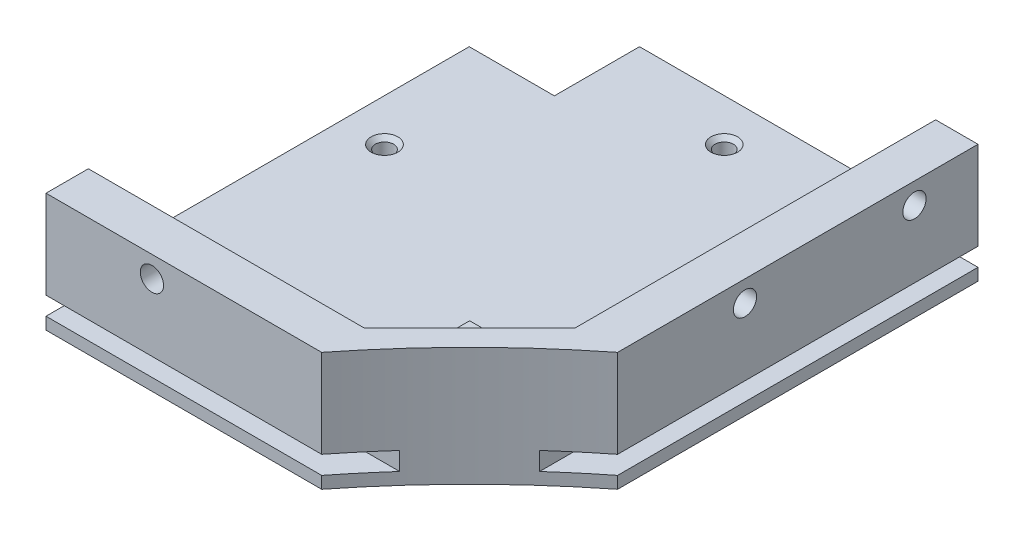
ISO-10303-21;
HEADER;
FILE_DESCRIPTION(('STEP AP214'),'2;1');
FILE_NAME('part.step','',(''),(''),'','','');
FILE_SCHEMA(('AUTOMOTIVE_DESIGN { 1 0 10303 214 1 1 1 1 }'));
ENDSEC;
DATA;
#1=APPLICATION_CONTEXT('core data for automotive mechanical design processes');
#2=APPLICATION_PROTOCOL_DEFINITION('international standard','automotive_design',2000,#1);
#3=PRODUCT_CONTEXT('',#1,'mechanical');
#4=PRODUCT('Part','Part','',(#3));
#5=PRODUCT_RELATED_PRODUCT_CATEGORY('part','',(#4));
#6=PRODUCT_DEFINITION_FORMATION('','',#4);
#7=PRODUCT_DEFINITION_CONTEXT('part definition',#1,'design');
#8=PRODUCT_DEFINITION('design','',#6,#7);
#9=PRODUCT_DEFINITION_SHAPE('','',#8);
#10=(LENGTH_UNIT() NAMED_UNIT(*) SI_UNIT(.MILLI.,.METRE.));
#11=(NAMED_UNIT(*) PLANE_ANGLE_UNIT() SI_UNIT($,.RADIAN.));
#12=(NAMED_UNIT(*) SI_UNIT($,.STERADIAN.) SOLID_ANGLE_UNIT());
#13=UNCERTAINTY_MEASURE_WITH_UNIT(LENGTH_MEASURE(1.E-05),#10,'distance_accuracy_value','');
#14=(GEOMETRIC_REPRESENTATION_CONTEXT(3) GLOBAL_UNCERTAINTY_ASSIGNED_CONTEXT((#13)) GLOBAL_UNIT_ASSIGNED_CONTEXT((#10,
#11,#12)) REPRESENTATION_CONTEXT('',''));
#15=CARTESIAN_POINT('',(0.,0.,0.));
#16=DIRECTION('',(0.,0.,1.));
#17=DIRECTION('',(1.,0.,0.));
#18=AXIS2_PLACEMENT_3D('',#15,#16,#17);
#19=CARTESIAN_POINT('',(160.08,28.,-429.92));
#20=DIRECTION('',(1.,0.,0.));
#21=DIRECTION('',(0.,0.,-1.));
#22=AXIS2_PLACEMENT_3D('',#19,#20,#21);
#23=PLANE('',#22);
#24=DIRECTION('',(0.,0.,1.));
#25=VECTOR('',#24,1.);
#26=CARTESIAN_POINT('',(160.08,17.,-489.92));
#27=LINE('',#26,#25);
#28=CARTESIAN_POINT('',(160.08,17.,-489.92));
#29=VERTEX_POINT('',#28);
#30=CARTESIAN_POINT('',(160.08,17.,-465.));
#31=VERTEX_POINT('',#30);
#32=EDGE_CURVE('E262',#29,#31,#27,.T.);
#33=ORIENTED_EDGE('',*,*,#32,.F.);
#34=DIRECTION('',(0.,-1.,0.));
#35=VECTOR('',#34,1.);
#36=CARTESIAN_POINT('',(160.08,28.,-489.92));
#37=LINE('',#36,#35);
#38=CARTESIAN_POINT('',(160.08,8.,-489.92));
#39=VERTEX_POINT('',#38);
#40=EDGE_CURVE('E272',#29,#39,#37,.T.);
#41=ORIENTED_EDGE('',*,*,#40,.T.);
#42=DIRECTION('',(0.,0.,-1.));
#43=VECTOR('',#42,1.);
#44=CARTESIAN_POINT('',(160.08,8.,-429.92));
#45=LINE('',#44,#43);
#46=CARTESIAN_POINT('',(160.08,8.,-475.));
#47=VERTEX_POINT('',#46);
#48=EDGE_CURVE('E279',#47,#39,#45,.T.);
#49=ORIENTED_EDGE('',*,*,#48,.F.);
#50=DIRECTION('',(0.,-0.668964731622449,-0.743294146247167));
#51=VECTOR('',#50,1.);
#52=CARTESIAN_POINT('',(160.08,17.,-465.));
#53=LINE('',#52,#51);
#54=EDGE_CURVE('E319',#31,#47,#53,.T.);
#55=ORIENTED_EDGE('',*,*,#54,.F.);
#56=EDGE_LOOP('',(#33,#41,#49,#55));
#57=FACE_BOUND('',#56,.T.);
#58=ADVANCED_FACE('F48',(#57),#23,.F.);
#59=CARTESIAN_POINT('',(0.,0.,-489.92));
#60=DIRECTION('',(0.,0.,1.));
#61=DIRECTION('',(1.,0.,0.));
#62=AXIS2_PLACEMENT_3D('',#59,#60,#61);
#63=PLANE('',#62);
#64=DIRECTION('',(-1.,0.,0.));
#65=VECTOR('',#64,1.);
#66=CARTESIAN_POINT('',(185.,17.,-489.92));
#67=LINE('',#66,#65);
#68=CARTESIAN_POINT('',(185.,17.,-489.92));
#69=VERTEX_POINT('',#68);
#70=EDGE_CURVE('E259',#69,#29,#67,.T.);
#71=ORIENTED_EDGE('',*,*,#70,.F.);
#72=DIRECTION('',(0.743294146247166,0.66896473162245,0.));
#73=VECTOR('',#72,1.);
#74=CARTESIAN_POINT('',(185.,17.,-489.92));
#75=LINE('',#74,#73);
#76=CARTESIAN_POINT('',(175.,8.,-489.92));
#77=VERTEX_POINT('',#76);
#78=EDGE_CURVE('E327',#77,#69,#75,.T.);
#79=ORIENTED_EDGE('',*,*,#78,.F.);
#80=DIRECTION('',(1.,0.,0.));
#81=VECTOR('',#80,1.);
#82=CARTESIAN_POINT('',(160.08,8.,-489.92));
#83=LINE('',#82,#81);
#84=EDGE_CURVE('E275',#39,#77,#83,.T.);
#85=ORIENTED_EDGE('',*,*,#84,.F.);
#86=ORIENTED_EDGE('',*,*,#40,.F.);
#87=EDGE_LOOP('',(#71,#79,#85,#86));
#88=FACE_BOUND('',#87,.T.);
#89=ADVANCED_FACE('F537',(#88),#63,.F.);
#90=CARTESIAN_POINT('',(0.,8.,0.));
#91=DIRECTION('',(0.,-1.,0.));
#92=DIRECTION('',(0.,0.,-1.));
#93=AXIS2_PLACEMENT_3D('',#90,#91,#92);
#94=PLANE('',#93);
#95=CARTESIAN_POINT('',(105.,8.,-524.9));
#96=DIRECTION('',(0.,-1.,0.));
#97=DIRECTION('',(0.,0.,-1.));
#98=AXIS2_PLACEMENT_3D('',#95,#96,#97);
#99=CIRCLE('',#98,3.14999999999999);
#100=CARTESIAN_POINT('',(105.,8.,-528.05));
#101=VERTEX_POINT('',#100);
#102=EDGE_CURVE('E58',#101,#101,#99,.T.);
#103=ORIENTED_EDGE('',*,*,#102,.T.);
#104=EDGE_LOOP('',(#103));
#105=FACE_BOUND('',#104,.T.);
#106=CARTESIAN_POINT('',(145.1,8.,-565.));
#107=DIRECTION('',(0.,-1.,0.));
#108=DIRECTION('',(0.,0.,-1.));
#109=AXIS2_PLACEMENT_3D('',#106,#107,#108);
#110=CIRCLE('',#109,3.14999999999999);
#111=CARTESIAN_POINT('',(145.1,8.,-568.15));
#112=VERTEX_POINT('',#111);
#113=EDGE_CURVE('E422',#112,#112,#110,.T.);
#114=ORIENTED_EDGE('',*,*,#113,.T.);
#115=EDGE_LOOP('',(#114));
#116=FACE_BOUND('',#115,.T.);
#117=DIRECTION('',(-1.,0.,0.));
#118=VECTOR('',#117,1.);
#119=CARTESIAN_POINT('',(0.,8.,-575.));
#120=LINE('',#119,#118);
#121=CARTESIAN_POINT('',(175.,8.,-575.));
#122=VERTEX_POINT('',#121);
#123=CARTESIAN_POINT('',(115.1,8.,-575.));
#124=VERTEX_POINT('',#123);
#125=EDGE_CURVE('E493',#122,#124,#120,.T.);
#126=ORIENTED_EDGE('',*,*,#125,.T.);
#127=DIRECTION('',(0.,0.,-1.));
#128=VECTOR('',#127,1.);
#129=CARTESIAN_POINT('',(115.1,8.,-575.));
#130=LINE('',#129,#128);
#131=CARTESIAN_POINT('',(115.1,8.,-554.9));
#132=VERTEX_POINT('',#131);
#133=EDGE_CURVE('E65',#132,#124,#130,.T.);
#134=ORIENTED_EDGE('',*,*,#133,.F.);
#135=DIRECTION('',(1.,0.,0.));
#136=VECTOR('',#135,1.);
#137=CARTESIAN_POINT('',(115.1,8.,-554.9));
#138=LINE('',#137,#136);
#139=CARTESIAN_POINT('',(95.,8.,-554.9));
#140=VERTEX_POINT('',#139);
#141=EDGE_CURVE('E203',#140,#132,#138,.T.);
#142=ORIENTED_EDGE('',*,*,#141,.F.);
#143=DIRECTION('',(0.,0.,1.));
#144=VECTOR('',#143,1.);
#145=CARTESIAN_POINT('',(95.,8.,0.));
#146=LINE('',#145,#144);
#147=CARTESIAN_POINT('',(95.,8.00000000000002,-475.));
#148=VERTEX_POINT('',#147);
#149=EDGE_CURVE('E215',#140,#148,#146,.T.);
#150=ORIENTED_EDGE('',*,*,#149,.T.);
#151=DIRECTION('',(-1.,0.,0.));
#152=VECTOR('',#151,1.);
#153=CARTESIAN_POINT('',(160.08,8.,-475.));
#154=LINE('',#153,#152);
#155=EDGE_CURVE('E324',#47,#148,#154,.T.);
#156=ORIENTED_EDGE('',*,*,#155,.F.);
#157=ORIENTED_EDGE('',*,*,#48,.T.);
#158=ORIENTED_EDGE('',*,*,#84,.T.);
#159=DIRECTION('',(0.,0.,-1.));
#160=VECTOR('',#159,1.);
#161=CARTESIAN_POINT('',(175.,8.,-489.92));
#162=LINE('',#161,#160);
#163=EDGE_CURVE('E346',#77,#122,#162,.T.);
#164=ORIENTED_EDGE('',*,*,#163,.T.);
#165=EDGE_LOOP('',(#126,#134,#142,#150,#156,#157,#158,#164));
#166=FACE_BOUND('',#165,.T.);
#167=ADVANCED_FACE('F213',(#105,#116,#166),#94,.F.);
#168=CARTESIAN_POINT('',(195.,0.,-489.924225024707));
#169=DIRECTION('',(1.,0.,0.));
#170=DIRECTION('',(0.,0.,-1.));
#171=AXIS2_PLACEMENT_3D('',#168,#169,#170);
#172=PLANE('',#171);
#173=DIRECTION('',(0.,1.,0.));
#174=VECTOR('',#173,1.);
#175=CARTESIAN_POINT('',(195.,0.,-575.));
#176=LINE('',#175,#174);
#177=CARTESIAN_POINT('',(195.,7.15,-575.));
#178=VERTEX_POINT('',#177);
#179=CARTESIAN_POINT('',(195.,28.,-575.));
#180=VERTEX_POINT('',#179);
#181=EDGE_CURVE('E464',#178,#180,#176,.T.);
#182=ORIENTED_EDGE('',*,*,#181,.T.);
#183=DIRECTION('',(0.,0.,-1.));
#184=VECTOR('',#183,1.);
#185=CARTESIAN_POINT('',(195.,28.,-489.92));
#186=LINE('',#185,#184);
#187=CARTESIAN_POINT('',(195.,28.,-489.924225024706));
#188=VERTEX_POINT('',#187);
#189=EDGE_CURVE('E347',#188,#180,#186,.T.);
#190=ORIENTED_EDGE('',*,*,#189,.F.);
#191=DIRECTION('',(0.,1.,0.));
#192=VECTOR('',#191,1.);
#193=CARTESIAN_POINT('',(195.,0.,-489.924225024707));
#194=LINE('',#193,#192);
#195=CARTESIAN_POINT('',(195.,7.15,-489.924225024707));
#196=VERTEX_POINT('',#195);
#197=EDGE_CURVE('E379',#188,#196,#194,.F.);
#198=ORIENTED_EDGE('',*,*,#197,.T.);
#199=DIRECTION('',(0.,0.,1.));
#200=VECTOR('',#199,1.);
#201=CARTESIAN_POINT('',(195.,7.15,-489.924225024707));
#202=LINE('',#201,#200);
#203=EDGE_CURVE('E398',#178,#196,#202,.T.);
#204=ORIENTED_EDGE('',*,*,#203,.F.);
#205=EDGE_LOOP('',(#182,#190,#198,#204));
#206=FACE_BOUND('',#205,.T.);
#207=CARTESIAN_POINT('',(195.,23.,-560.));
#208=DIRECTION('',(1.,0.,0.));
#209=DIRECTION('',(0.,0.,-1.));
#210=AXIS2_PLACEMENT_3D('',#207,#208,#209);
#211=CIRCLE('',#210,2.75000000000004);
#212=CARTESIAN_POINT('',(195.,23.,-562.75));
#213=VERTEX_POINT('',#212);
#214=EDGE_CURVE('E251',#213,#213,#211,.T.);
#215=ORIENTED_EDGE('',*,*,#214,.F.);
#216=EDGE_LOOP('',(#215));
#217=FACE_BOUND('',#216,.T.);
#218=CARTESIAN_POINT('',(195.,23.,-520.));
#219=DIRECTION('',(1.,0.,0.));
#220=DIRECTION('',(0.,0.,-1.));
#221=AXIS2_PLACEMENT_3D('',#218,#219,#220);
#222=CIRCLE('',#221,2.75000000000004);
#223=CARTESIAN_POINT('',(195.,23.,-522.75));
#224=VERTEX_POINT('',#223);
#225=EDGE_CURVE('E244',#224,#224,#222,.T.);
#226=ORIENTED_EDGE('',*,*,#225,.F.);
#227=EDGE_LOOP('',(#226));
#228=FACE_BOUND('',#227,.T.);
#229=ADVANCED_FACE('F551',(#206,#217,#228),#172,.T.);
#230=CARTESIAN_POINT('',(195.,0.,-455.));
#231=DIRECTION('',(0.,0.,1.));
#232=DIRECTION('',(1.,0.,0.));
#233=AXIS2_PLACEMENT_3D('',#230,#231,#232);
#234=PLANE('',#233);
#235=DIRECTION('',(0.,1.,0.));
#236=VECTOR('',#235,1.);
#237=CARTESIAN_POINT('',(95.,0.,-455.));
#238=LINE('',#237,#236);
#239=CARTESIAN_POINT('',(95.,0.,-455.));
#240=VERTEX_POINT('',#239);
#241=CARTESIAN_POINT('',(95.,2.85,-455.));
#242=VERTEX_POINT('',#241);
#243=EDGE_CURVE('E503',#240,#242,#238,.T.);
#244=ORIENTED_EDGE('',*,*,#243,.F.);
#245=DIRECTION('',(1.,0.,0.));
#246=VECTOR('',#245,1.);
#247=CARTESIAN_POINT('',(160.075774975293,0.,-455.));
#248=LINE('',#247,#246);
#249=CARTESIAN_POINT('',(160.075774975293,0.,-455.));
#250=VERTEX_POINT('',#249);
#251=EDGE_CURVE('E351',#240,#250,#248,.T.);
#252=ORIENTED_EDGE('',*,*,#251,.T.);
#253=DIRECTION('',(0.,1.,0.));
#254=VECTOR('',#253,1.);
#255=CARTESIAN_POINT('',(160.075774975293,0.,-455.));
#256=LINE('',#255,#254);
#257=CARTESIAN_POINT('',(160.075774975293,2.85,-455.));
#258=VERTEX_POINT('',#257);
#259=EDGE_CURVE('E374',#250,#258,#256,.T.);
#260=ORIENTED_EDGE('',*,*,#259,.T.);
#261=DIRECTION('',(1.,0.,0.));
#262=VECTOR('',#261,1.);
#263=CARTESIAN_POINT('',(195.,2.85,-455.));
#264=LINE('',#263,#262);
#265=EDGE_CURVE('E387',#242,#258,#264,.T.);
#266=ORIENTED_EDGE('',*,*,#265,.F.);
#267=EDGE_LOOP('',(#244,#252,#260,#266));
#268=FACE_BOUND('',#267,.T.);
#269=ADVANCED_FACE('F447',(#268),#234,.T.);
#270=CARTESIAN_POINT('',(0.,0.,0.));
#271=DIRECTION('',(0.,-1.,0.));
#272=DIRECTION('',(0.,0.,-1.));
#273=AXIS2_PLACEMENT_3D('',#270,#271,#272);
#274=PLANE('',#273);
#275=CARTESIAN_POINT('',(105.,0.,-524.9));
#276=DIRECTION('',(0.,-1.,0.));
#277=DIRECTION('',(0.,0.,-1.));
#278=AXIS2_PLACEMENT_3D('',#275,#276,#277);
#279=CIRCLE('',#278,2.15);
#280=CARTESIAN_POINT('',(105.,0.,-527.05));
#281=VERTEX_POINT('',#280);
#282=EDGE_CURVE('E218',#281,#281,#279,.T.);
#283=ORIENTED_EDGE('',*,*,#282,.F.);
#284=EDGE_LOOP('',(#283));
#285=FACE_BOUND('',#284,.T.);
#286=CARTESIAN_POINT('',(145.1,0.,-565.));
#287=DIRECTION('',(0.,-1.,0.));
#288=DIRECTION('',(0.,0.,-1.));
#289=AXIS2_PLACEMENT_3D('',#286,#287,#288);
#290=CIRCLE('',#289,2.15000000000002);
#291=CARTESIAN_POINT('',(145.1,0.,-567.15));
#292=VERTEX_POINT('',#291);
#293=EDGE_CURVE('E412',#292,#292,#290,.T.);
#294=ORIENTED_EDGE('',*,*,#293,.F.);
#295=EDGE_LOOP('',(#294));
#296=FACE_BOUND('',#295,.T.);
#297=DIRECTION('',(0.,0.,1.));
#298=VECTOR('',#297,1.);
#299=CARTESIAN_POINT('',(115.1,0.,0.));
#300=LINE('',#299,#298);
#301=CARTESIAN_POINT('',(115.1,0.,-575.));
#302=VERTEX_POINT('',#301);
#303=CARTESIAN_POINT('',(115.1,0.,-554.9));
#304=VERTEX_POINT('',#303);
#305=EDGE_CURVE('E452',#302,#304,#300,.T.);
#306=ORIENTED_EDGE('',*,*,#305,.F.);
#307=DIRECTION('',(1.,0.,0.));
#308=VECTOR('',#307,1.);
#309=CARTESIAN_POINT('',(195.,0.,-575.));
#310=LINE('',#309,#308);
#311=CARTESIAN_POINT('',(195.,0.,-575.));
#312=VERTEX_POINT('',#311);
#313=EDGE_CURVE('E455',#302,#312,#310,.T.);
#314=ORIENTED_EDGE('',*,*,#313,.T.);
#315=DIRECTION('',(0.,0.,-1.));
#316=VECTOR('',#315,1.);
#317=CARTESIAN_POINT('',(195.,0.,-455.));
#318=LINE('',#317,#316);
#319=CARTESIAN_POINT('',(195.,0.,-489.924225024707));
#320=VERTEX_POINT('',#319);
#321=EDGE_CURVE('E365',#320,#312,#318,.T.);
#322=ORIENTED_EDGE('',*,*,#321,.F.);
#323=CARTESIAN_POINT('',(325.,0.,-325.));
#324=DIRECTION('',(0.,1.,0.));
#325=DIRECTION('',(0.,0.,1.));
#326=AXIS2_PLACEMENT_3D('',#323,#324,#325);
#327=CIRCLE('',#326,210.);
#328=EDGE_CURVE('E369',#320,#250,#327,.T.);
#329=ORIENTED_EDGE('',*,*,#328,.T.);
#330=ORIENTED_EDGE('',*,*,#251,.F.);
#331=DIRECTION('',(0.,0.,-1.));
#332=VECTOR('',#331,1.);
#333=CARTESIAN_POINT('',(95.,0.,-650.));
#334=LINE('',#333,#332);
#335=CARTESIAN_POINT('',(95.,0.,-554.9));
#336=VERTEX_POINT('',#335);
#337=EDGE_CURVE('E499',#240,#336,#334,.T.);
#338=ORIENTED_EDGE('',*,*,#337,.T.);
#339=DIRECTION('',(-1.,0.,0.));
#340=VECTOR('',#339,1.);
#341=CARTESIAN_POINT('',(0.,0.,-554.9));
#342=LINE('',#341,#340);
#343=EDGE_CURVE('E205',#304,#336,#342,.T.);
#344=ORIENTED_EDGE('',*,*,#343,.F.);
#345=EDGE_LOOP('',(#306,#314,#322,#329,#330,#338,#344));
#346=FACE_BOUND('',#345,.T.);
#347=ADVANCED_FACE('F443',(#285,#296,#346),#274,.T.);
#348=CARTESIAN_POINT('',(325.,0.,-325.));
#349=DIRECTION('',(0.,1.,0.));
#350=DIRECTION('',(0.,0.,1.));
#351=AXIS2_PLACEMENT_3D('',#348,#349,#350);
#352=CYLINDRICAL_SURFACE('',#351,210.);
#353=ORIENTED_EDGE('',*,*,#197,.F.);
#354=CARTESIAN_POINT('',(325.,28.,-325.));
#355=DIRECTION('',(0.,1.,0.));
#356=DIRECTION('',(0.,0.,1.));
#357=AXIS2_PLACEMENT_3D('',#354,#355,#356);
#358=CIRCLE('',#357,210.);
#359=CARTESIAN_POINT('',(160.075774975294,28.,-455.));
#360=VERTEX_POINT('',#359);
#361=EDGE_CURVE('E266',#188,#360,#358,.T.);
#362=ORIENTED_EDGE('',*,*,#361,.T.);
#363=CARTESIAN_POINT('',(160.075774975293,7.15,-455.));
#364=VERTEX_POINT('',#363);
#365=EDGE_CURVE('E373',#364,#360,#256,.T.);
#366=ORIENTED_EDGE('',*,*,#365,.F.);
#367=CARTESIAN_POINT('',(325.,7.15000000000001,-325.));
#368=DIRECTION('',(0.,1.,0.));
#369=DIRECTION('',(0.,0.,1.));
#370=AXIS2_PLACEMENT_3D('',#367,#368,#369);
#371=CIRCLE('',#370,210.);
#372=CARTESIAN_POINT('',(168.475241575015,7.15,-465.));
#373=VERTEX_POINT('',#372);
#374=EDGE_CURVE('E304',#364,#373,#371,.F.);
#375=ORIENTED_EDGE('',*,*,#374,.T.);
#376=DIRECTION('',(0.,1.,0.));
#377=VECTOR('',#376,1.);
#378=CARTESIAN_POINT('',(168.475241575015,0.,-465.));
#379=LINE('',#378,#377);
#380=CARTESIAN_POINT('',(168.475241575015,2.85,-465.));
#381=VERTEX_POINT('',#380);
#382=EDGE_CURVE('E390',#373,#381,#379,.F.);
#383=ORIENTED_EDGE('',*,*,#382,.T.);
#384=CARTESIAN_POINT('',(325.,2.85,-325.));
#385=DIRECTION('',(0.,-1.,0.));
#386=DIRECTION('',(0.,0.,-1.));
#387=AXIS2_PLACEMENT_3D('',#384,#385,#386);
#388=CIRCLE('',#387,210.);
#389=EDGE_CURVE('E311',#381,#258,#388,.F.);
#390=ORIENTED_EDGE('',*,*,#389,.T.);
#391=ORIENTED_EDGE('',*,*,#259,.F.);
#392=ORIENTED_EDGE('',*,*,#328,.F.);
#393=CARTESIAN_POINT('',(195.,2.85,-489.924225024707));
#394=VERTEX_POINT('',#393);
#395=EDGE_CURVE('E378',#394,#320,#194,.F.);
#396=ORIENTED_EDGE('',*,*,#395,.F.);
#397=CARTESIAN_POINT('',(325.,2.84999999999998,-325.));
#398=DIRECTION('',(0.,-1.,0.));
#399=DIRECTION('',(1.,0.,0.));
#400=AXIS2_PLACEMENT_3D('',#397,#398,#399);
#401=CIRCLE('',#400,210.);
#402=CARTESIAN_POINT('',(185.,2.85,-481.524758424985));
#403=VERTEX_POINT('',#402);
#404=EDGE_CURVE('E288',#394,#403,#401,.F.);
#405=ORIENTED_EDGE('',*,*,#404,.T.);
#406=DIRECTION('',(0.,1.,0.));
#407=VECTOR('',#406,1.);
#408=CARTESIAN_POINT('',(185.,0.,-481.524758424985));
#409=LINE('',#408,#407);
#410=CARTESIAN_POINT('',(185.,7.15,-481.524758424985));
#411=VERTEX_POINT('',#410);
#412=EDGE_CURVE('E401',#403,#411,#409,.T.);
#413=ORIENTED_EDGE('',*,*,#412,.T.);
#414=CARTESIAN_POINT('',(325.,7.15,-325.));
#415=DIRECTION('',(0.,1.,0.));
#416=DIRECTION('',(0.,0.,1.));
#417=AXIS2_PLACEMENT_3D('',#414,#415,#416);
#418=CIRCLE('',#417,210.);
#419=EDGE_CURVE('E295',#411,#196,#418,.F.);
#420=ORIENTED_EDGE('',*,*,#419,.T.);
#421=EDGE_LOOP('',(#353,#362,#366,#375,#383,#390,#391,#392,#396,#405,#413,#420));
#422=FACE_BOUND('',#421,.T.);
#423=ADVANCED_FACE('F446',(#422),#352,.F.);
#424=CARTESIAN_POINT('',(95.,7.15,-455.));
#425=VERTEX_POINT('',#424);
#426=CARTESIAN_POINT('',(95.,28.,-455.));
#427=VERTEX_POINT('',#426);
#428=EDGE_CURVE('E502',#425,#427,#238,.T.);
#429=ORIENTED_EDGE('',*,*,#428,.F.);
#430=DIRECTION('',(-1.,0.,0.));
#431=VECTOR('',#430,1.);
#432=CARTESIAN_POINT('',(195.,7.15,-455.));
#433=LINE('',#432,#431);
#434=EDGE_CURVE('E383',#364,#425,#433,.T.);
#435=ORIENTED_EDGE('',*,*,#434,.F.);
#436=ORIENTED_EDGE('',*,*,#365,.T.);
#437=DIRECTION('',(-1.,0.,0.));
#438=VECTOR('',#437,1.);
#439=CARTESIAN_POINT('',(160.08,28.,-455.));
#440=LINE('',#439,#438);
#441=EDGE_CURVE('E323',#360,#427,#440,.T.);
#442=ORIENTED_EDGE('',*,*,#441,.T.);
#443=EDGE_LOOP('',(#429,#435,#436,#442));
#444=FACE_BOUND('',#443,.T.);
#445=CARTESIAN_POINT('',(120.,23.,-455.));
#446=DIRECTION('',(0.,0.,1.));
#447=DIRECTION('',(1.,0.,0.));
#448=AXIS2_PLACEMENT_3D('',#445,#446,#447);
#449=CIRCLE('',#448,2.75000000000001);
#450=CARTESIAN_POINT('',(122.75,23.,-455.));
#451=VERTEX_POINT('',#450);
#452=EDGE_CURVE('E230',#451,#451,#449,.T.);
#453=ORIENTED_EDGE('',*,*,#452,.F.);
#454=EDGE_LOOP('',(#453));
#455=FACE_BOUND('',#454,.T.);
#456=ADVANCED_FACE('F576',(#444,#455),#234,.T.);
#457=CARTESIAN_POINT('',(195.,2.85,-575.));
#458=VERTEX_POINT('',#457);
#459=EDGE_CURVE('E462',#312,#458,#176,.T.);
#460=ORIENTED_EDGE('',*,*,#459,.T.);
#461=DIRECTION('',(0.,0.,-1.));
#462=VECTOR('',#461,1.);
#463=CARTESIAN_POINT('',(195.,2.85,-489.924225024707));
#464=LINE('',#463,#462);
#465=EDGE_CURVE('E394',#394,#458,#464,.T.);
#466=ORIENTED_EDGE('',*,*,#465,.F.);
#467=ORIENTED_EDGE('',*,*,#395,.T.);
#468=ORIENTED_EDGE('',*,*,#321,.T.);
#469=EDGE_LOOP('',(#460,#466,#467,#468));
#470=FACE_BOUND('',#469,.T.);
#471=ADVANCED_FACE('F568',(#470),#172,.T.);
#472=CARTESIAN_POINT('',(195.,28.,-489.92));
#473=DIRECTION('',(0.,1.,0.));
#474=DIRECTION('',(0.,0.,1.));
#475=AXIS2_PLACEMENT_3D('',#472,#473,#474);
#476=PLANE('',#475);
#477=DIRECTION('',(1.,0.,0.));
#478=VECTOR('',#477,1.);
#479=CARTESIAN_POINT('',(195.,28.,-575.));
#480=LINE('',#479,#478);
#481=CARTESIAN_POINT('',(185.,28.,-575.));
#482=VERTEX_POINT('',#481);
#483=EDGE_CURVE('E465',#482,#180,#480,.T.);
#484=ORIENTED_EDGE('',*,*,#483,.F.);
#485=DIRECTION('',(0.,0.,-1.));
#486=VECTOR('',#485,1.);
#487=CARTESIAN_POINT('',(185.,28.,-489.92));
#488=LINE('',#487,#486);
#489=CARTESIAN_POINT('',(185.,28.,-489.92));
#490=VERTEX_POINT('',#489);
#491=EDGE_CURVE('E352',#490,#482,#488,.T.);
#492=ORIENTED_EDGE('',*,*,#491,.F.);
#493=DIRECTION('',(0.707106781186547,0.,-0.707106781186548));
#494=VECTOR('',#493,1.);
#495=CARTESIAN_POINT('',(160.08,28.,-465.));
#496=LINE('',#495,#494);
#497=CARTESIAN_POINT('',(160.08,28.,-465.));
#498=VERTEX_POINT('',#497);
#499=EDGE_CURVE('E255',#498,#490,#496,.T.);
#500=ORIENTED_EDGE('',*,*,#499,.F.);
#501=DIRECTION('',(-1.,0.,0.));
#502=VECTOR('',#501,1.);
#503=CARTESIAN_POINT('',(160.08,28.,-465.));
#504=LINE('',#503,#502);
#505=CARTESIAN_POINT('',(95.,28.,-465.));
#506=VERTEX_POINT('',#505);
#507=EDGE_CURVE('E332',#498,#506,#504,.T.);
#508=ORIENTED_EDGE('',*,*,#507,.T.);
#509=DIRECTION('',(0.,0.,-1.));
#510=VECTOR('',#509,1.);
#511=CARTESIAN_POINT('',(95.,28.,-650.));
#512=LINE('',#511,#510);
#513=EDGE_CURVE('E496',#427,#506,#512,.T.);
#514=ORIENTED_EDGE('',*,*,#513,.F.);
#515=ORIENTED_EDGE('',*,*,#441,.F.);
#516=ORIENTED_EDGE('',*,*,#361,.F.);
#517=ORIENTED_EDGE('',*,*,#189,.T.);
#518=EDGE_LOOP('',(#484,#492,#500,#508,#514,#515,#516,#517));
#519=FACE_BOUND('',#518,.T.);
#520=ADVANCED_FACE('F528',(#519),#476,.T.);
#521=CARTESIAN_POINT('',(185.,28.,-489.92));
#522=DIRECTION('',(-1.,0.,0.));
#523=DIRECTION('',(0.,0.,1.));
#524=AXIS2_PLACEMENT_3D('',#521,#522,#523);
#525=PLANE('',#524);
#526=DIRECTION('',(0.,1.,0.));
#527=VECTOR('',#526,1.);
#528=CARTESIAN_POINT('',(185.,28.,-575.));
#529=LINE('',#528,#527);
#530=CARTESIAN_POINT('',(185.,17.,-575.));
#531=VERTEX_POINT('',#530);
#532=EDGE_CURVE('E490',#531,#482,#529,.T.);
#533=ORIENTED_EDGE('',*,*,#532,.F.);
#534=DIRECTION('',(0.,0.,-1.));
#535=VECTOR('',#534,1.);
#536=CARTESIAN_POINT('',(185.,17.,-489.92));
#537=LINE('',#536,#535);
#538=EDGE_CURVE('E356',#69,#531,#537,.T.);
#539=ORIENTED_EDGE('',*,*,#538,.F.);
#540=DIRECTION('',(0.,1.,0.));
#541=VECTOR('',#540,1.);
#542=CARTESIAN_POINT('',(185.,28.,-489.92));
#543=LINE('',#542,#541);
#544=EDGE_CURVE('E342',#69,#490,#543,.T.);
#545=ORIENTED_EDGE('',*,*,#544,.T.);
#546=ORIENTED_EDGE('',*,*,#491,.T.);
#547=EDGE_LOOP('',(#533,#539,#545,#546));
#548=FACE_BOUND('',#547,.T.);
#549=CARTESIAN_POINT('',(185.,23.,-560.));
#550=DIRECTION('',(-1.,0.,0.));
#551=DIRECTION('',(0.,0.,1.));
#552=AXIS2_PLACEMENT_3D('',#549,#550,#551);
#553=CIRCLE('',#552,2.75000000000004);
#554=CARTESIAN_POINT('',(185.,23.,-557.25));
#555=VERTEX_POINT('',#554);
#556=EDGE_CURVE('E240',#555,#555,#553,.T.);
#557=ORIENTED_EDGE('',*,*,#556,.F.);
#558=EDGE_LOOP('',(#557));
#559=FACE_BOUND('',#558,.T.);
#560=CARTESIAN_POINT('',(185.,23.,-520.));
#561=DIRECTION('',(-1.,0.,0.));
#562=DIRECTION('',(0.,0.,1.));
#563=AXIS2_PLACEMENT_3D('',#560,#561,#562);
#564=CIRCLE('',#563,2.75000000000004);
#565=CARTESIAN_POINT('',(185.,23.,-517.25));
#566=VERTEX_POINT('',#565);
#567=EDGE_CURVE('E239',#566,#566,#564,.T.);
#568=ORIENTED_EDGE('',*,*,#567,.F.);
#569=EDGE_LOOP('',(#568));
#570=FACE_BOUND('',#569,.T.);
#571=ADVANCED_FACE('F532',(#548,#559,#570),#525,.T.);
#572=CARTESIAN_POINT('',(185.,17.,-489.92));
#573=DIRECTION('',(-0.66896473162245,0.743294146247166,0.));
#574=DIRECTION('',(-0.743294146247166,-0.668964731622451,0.));
#575=AXIS2_PLACEMENT_3D('',#572,#573,#574);
#576=PLANE('',#575);
#577=DIRECTION('',(0.743294146247166,0.668964731622451,0.));
#578=VECTOR('',#577,1.);
#579=CARTESIAN_POINT('',(185.,17.,-575.));
#580=LINE('',#579,#578);
#581=EDGE_CURVE('E487',#122,#531,#580,.T.);
#582=ORIENTED_EDGE('',*,*,#581,.F.);
#583=ORIENTED_EDGE('',*,*,#163,.F.);
#584=ORIENTED_EDGE('',*,*,#78,.T.);
#585=ORIENTED_EDGE('',*,*,#538,.T.);
#586=EDGE_LOOP('',(#582,#583,#584,#585));
#587=FACE_BOUND('',#586,.T.);
#588=ADVANCED_FACE('F547',(#587),#576,.T.);
#589=CARTESIAN_POINT('',(160.08,17.,-465.));
#590=DIRECTION('',(0.,0.743294146247167,-0.66896473162245));
#591=DIRECTION('',(0.,0.668964731622449,0.743294146247167));
#592=AXIS2_PLACEMENT_3D('',#589,#590,#591);
#593=PLANE('',#592);
#594=DIRECTION('',(0.,-0.668964731622449,-0.743294146247167));
#595=VECTOR('',#594,1.);
#596=CARTESIAN_POINT('',(95.,17.,-465.));
#597=LINE('',#596,#595);
#598=CARTESIAN_POINT('',(95.,17.,-465.));
#599=VERTEX_POINT('',#598);
#600=EDGE_CURVE('E222',#599,#148,#597,.T.);
#601=ORIENTED_EDGE('',*,*,#600,.F.);
#602=DIRECTION('',(-1.,0.,0.));
#603=VECTOR('',#602,1.);
#604=CARTESIAN_POINT('',(160.08,17.,-465.));
#605=LINE('',#604,#603);
#606=EDGE_CURVE('E328',#31,#599,#605,.T.);
#607=ORIENTED_EDGE('',*,*,#606,.F.);
#608=ORIENTED_EDGE('',*,*,#54,.T.);
#609=ORIENTED_EDGE('',*,*,#155,.T.);
#610=EDGE_LOOP('',(#601,#607,#608,#609));
#611=FACE_BOUND('',#610,.T.);
#612=ADVANCED_FACE('F518',(#611),#593,.T.);
#613=CARTESIAN_POINT('',(160.08,28.,-465.));
#614=DIRECTION('',(0.,0.,-1.));
#615=DIRECTION('',(-1.,0.,0.));
#616=AXIS2_PLACEMENT_3D('',#613,#614,#615);
#617=PLANE('',#616);
#618=DIRECTION('',(0.,-1.,0.));
#619=VECTOR('',#618,1.);
#620=CARTESIAN_POINT('',(95.,28.,-465.));
#621=LINE('',#620,#619);
#622=EDGE_CURVE('E232',#506,#599,#621,.T.);
#623=ORIENTED_EDGE('',*,*,#622,.F.);
#624=ORIENTED_EDGE('',*,*,#507,.F.);
#625=DIRECTION('',(0.,-1.,0.));
#626=VECTOR('',#625,1.);
#627=CARTESIAN_POINT('',(160.08,28.,-465.));
#628=LINE('',#627,#626);
#629=EDGE_CURVE('E315',#498,#31,#628,.T.);
#630=ORIENTED_EDGE('',*,*,#629,.T.);
#631=ORIENTED_EDGE('',*,*,#606,.T.);
#632=EDGE_LOOP('',(#623,#624,#630,#631));
#633=FACE_BOUND('',#632,.T.);
#634=CARTESIAN_POINT('',(120.,23.,-465.));
#635=DIRECTION('',(0.,0.,-1.));
#636=DIRECTION('',(-1.,0.,0.));
#637=AXIS2_PLACEMENT_3D('',#634,#635,#636);
#638=CIRCLE('',#637,2.75000000000001);
#639=CARTESIAN_POINT('',(117.25,23.,-465.));
#640=VERTEX_POINT('',#639);
#641=EDGE_CURVE('E225',#640,#640,#638,.T.);
#642=ORIENTED_EDGE('',*,*,#641,.F.);
#643=EDGE_LOOP('',(#642));
#644=FACE_BOUND('',#643,.T.);
#645=ADVANCED_FACE('F519',(#633,#644),#617,.T.);
#646=CARTESIAN_POINT('',(195.,7.15,-465.));
#647=DIRECTION('',(0.,0.,-1.));
#648=DIRECTION('',(-1.,0.,0.));
#649=AXIS2_PLACEMENT_3D('',#646,#647,#648);
#650=PLANE('',#649);
#651=DIRECTION('',(-1.,0.,0.));
#652=VECTOR('',#651,1.);
#653=CARTESIAN_POINT('',(195.,7.15,-465.));
#654=LINE('',#653,#652);
#655=CARTESIAN_POINT('',(95.,7.15,-465.));
#656=VERTEX_POINT('',#655);
#657=EDGE_CURVE('E299',#373,#656,#654,.T.);
#658=ORIENTED_EDGE('',*,*,#657,.T.);
#659=DIRECTION('',(0.,-1.,0.));
#660=VECTOR('',#659,1.);
#661=CARTESIAN_POINT('',(95.,7.15,-465.));
#662=LINE('',#661,#660);
#663=CARTESIAN_POINT('',(95.,2.85,-465.));
#664=VERTEX_POINT('',#663);
#665=EDGE_CURVE('E73',#656,#664,#662,.T.);
#666=ORIENTED_EDGE('',*,*,#665,.T.);
#667=DIRECTION('',(-1.,0.,0.));
#668=VECTOR('',#667,1.);
#669=CARTESIAN_POINT('',(195.,2.85,-465.));
#670=LINE('',#669,#668);
#671=EDGE_CURVE('E300',#381,#664,#670,.T.);
#672=ORIENTED_EDGE('',*,*,#671,.F.);
#673=ORIENTED_EDGE('',*,*,#382,.F.);
#674=EDGE_LOOP('',(#658,#666,#672,#673));
#675=FACE_BOUND('',#674,.T.);
#676=ADVANCED_FACE('F583',(#675),#650,.F.);
#677=CARTESIAN_POINT('',(195.,2.85,-465.));
#678=DIRECTION('',(0.,-1.,0.));
#679=DIRECTION('',(0.,0.,-1.));
#680=AXIS2_PLACEMENT_3D('',#677,#678,#679);
#681=PLANE('',#680);
#682=ORIENTED_EDGE('',*,*,#671,.T.);
#683=DIRECTION('',(0.,0.,1.));
#684=VECTOR('',#683,1.);
#685=CARTESIAN_POINT('',(95.,2.85,-465.));
#686=LINE('',#685,#684);
#687=EDGE_CURVE('E508',#664,#242,#686,.T.);
#688=ORIENTED_EDGE('',*,*,#687,.T.);
#689=ORIENTED_EDGE('',*,*,#265,.T.);
#690=ORIENTED_EDGE('',*,*,#389,.F.);
#691=EDGE_LOOP('',(#682,#688,#689,#690));
#692=FACE_BOUND('',#691,.T.);
#693=ADVANCED_FACE('F585',(#692),#681,.F.);
#694=CARTESIAN_POINT('',(195.,7.15,-455.));
#695=DIRECTION('',(0.,1.,0.));
#696=DIRECTION('',(0.,0.,1.));
#697=AXIS2_PLACEMENT_3D('',#694,#695,#696);
#698=PLANE('',#697);
#699=ORIENTED_EDGE('',*,*,#434,.T.);
#700=DIRECTION('',(0.,0.,-1.));
#701=VECTOR('',#700,1.);
#702=CARTESIAN_POINT('',(95.,7.15,-455.));
#703=LINE('',#702,#701);
#704=EDGE_CURVE('E405',#425,#656,#703,.T.);
#705=ORIENTED_EDGE('',*,*,#704,.T.);
#706=ORIENTED_EDGE('',*,*,#657,.F.);
#707=ORIENTED_EDGE('',*,*,#374,.F.);
#708=EDGE_LOOP('',(#699,#705,#706,#707));
#709=FACE_BOUND('',#708,.T.);
#710=ADVANCED_FACE('F579',(#709),#698,.F.);
#711=CARTESIAN_POINT('',(185.,7.15,-455.));
#712=DIRECTION('',(-1.,0.,0.));
#713=DIRECTION('',(0.,0.,1.));
#714=AXIS2_PLACEMENT_3D('',#711,#712,#713);
#715=PLANE('',#714);
#716=DIRECTION('',(0.,0.,-1.));
#717=VECTOR('',#716,1.);
#718=CARTESIAN_POINT('',(185.,2.85,-455.));
#719=LINE('',#718,#717);
#720=CARTESIAN_POINT('',(185.,2.85,-575.));
#721=VERTEX_POINT('',#720);
#722=EDGE_CURVE('E283',#403,#721,#719,.T.);
#723=ORIENTED_EDGE('',*,*,#722,.T.);
#724=DIRECTION('',(0.,1.,0.));
#725=VECTOR('',#724,1.);
#726=CARTESIAN_POINT('',(185.,7.15,-575.));
#727=LINE('',#726,#725);
#728=CARTESIAN_POINT('',(185.,7.15,-575.));
#729=VERTEX_POINT('',#728);
#730=EDGE_CURVE('E479',#721,#729,#727,.T.);
#731=ORIENTED_EDGE('',*,*,#730,.T.);
#732=DIRECTION('',(0.,0.,-1.));
#733=VECTOR('',#732,1.);
#734=CARTESIAN_POINT('',(185.,7.15,-455.));
#735=LINE('',#734,#733);
#736=EDGE_CURVE('E284',#411,#729,#735,.T.);
#737=ORIENTED_EDGE('',*,*,#736,.F.);
#738=ORIENTED_EDGE('',*,*,#412,.F.);
#739=EDGE_LOOP('',(#723,#731,#737,#738));
#740=FACE_BOUND('',#739,.T.);
#741=ADVANCED_FACE('F561',(#740),#715,.F.);
#742=CARTESIAN_POINT('',(195.,7.15,-455.));
#743=DIRECTION('',(0.,1.,0.));
#744=DIRECTION('',(0.,0.,1.));
#745=AXIS2_PLACEMENT_3D('',#742,#743,#744);
#746=PLANE('',#745);
#747=ORIENTED_EDGE('',*,*,#736,.T.);
#748=DIRECTION('',(1.,0.,0.));
#749=VECTOR('',#748,1.);
#750=CARTESIAN_POINT('',(195.,7.15,-575.));
#751=LINE('',#750,#749);
#752=EDGE_CURVE('E483',#729,#178,#751,.T.);
#753=ORIENTED_EDGE('',*,*,#752,.T.);
#754=ORIENTED_EDGE('',*,*,#203,.T.);
#755=ORIENTED_EDGE('',*,*,#419,.F.);
#756=EDGE_LOOP('',(#747,#753,#754,#755));
#757=FACE_BOUND('',#756,.T.);
#758=ADVANCED_FACE('F559',(#757),#746,.F.);
#759=CARTESIAN_POINT('',(185.,2.85,-455.));
#760=DIRECTION('',(0.,-1.,0.));
#761=DIRECTION('',(1.,0.,0.));
#762=AXIS2_PLACEMENT_3D('',#759,#760,#761);
#763=PLANE('',#762);
#764=ORIENTED_EDGE('',*,*,#465,.T.);
#765=DIRECTION('',(-1.,0.,0.));
#766=VECTOR('',#765,1.);
#767=CARTESIAN_POINT('',(185.,2.85,-575.));
#768=LINE('',#767,#766);
#769=EDGE_CURVE('E475',#458,#721,#768,.T.);
#770=ORIENTED_EDGE('',*,*,#769,.T.);
#771=ORIENTED_EDGE('',*,*,#722,.F.);
#772=ORIENTED_EDGE('',*,*,#404,.F.);
#773=EDGE_LOOP('',(#764,#770,#771,#772));
#774=FACE_BOUND('',#773,.T.);
#775=ADVANCED_FACE('F564',(#774),#763,.F.);
#776=CARTESIAN_POINT('',(160.08,17.,-465.));
#777=DIRECTION('',(0.707106781186548,0.,0.707106781186547));
#778=DIRECTION('',(0.707106781186547,0.,-0.707106781186548));
#779=AXIS2_PLACEMENT_3D('',#776,#777,#778);
#780=PLANE('',#779);
#781=ORIENTED_EDGE('',*,*,#499,.T.);
#782=ORIENTED_EDGE('',*,*,#544,.F.);
#783=DIRECTION('',(0.707106781186547,0.,-0.707106781186548));
#784=VECTOR('',#783,1.);
#785=CARTESIAN_POINT('',(160.08,17.,-465.));
#786=LINE('',#785,#784);
#787=EDGE_CURVE('E256',#31,#69,#786,.T.);
#788=ORIENTED_EDGE('',*,*,#787,.F.);
#789=ORIENTED_EDGE('',*,*,#629,.F.);
#790=EDGE_LOOP('',(#781,#782,#788,#789));
#791=FACE_BOUND('',#790,.T.);
#792=ADVANCED_FACE('F523',(#791),#780,.F.);
#793=CARTESIAN_POINT('',(0.,17.,0.));
#794=DIRECTION('',(0.,1.,0.));
#795=DIRECTION('',(0.,0.,1.));
#796=AXIS2_PLACEMENT_3D('',#793,#794,#795);
#797=PLANE('',#796);
#798=ORIENTED_EDGE('',*,*,#787,.T.);
#799=ORIENTED_EDGE('',*,*,#70,.T.);
#800=ORIENTED_EDGE('',*,*,#32,.T.);
#801=EDGE_LOOP('',(#798,#799,#800));
#802=FACE_BOUND('',#801,.T.);
#803=ADVANCED_FACE('F541',(#802),#797,.T.);
#804=CARTESIAN_POINT('',(196.,23.,-520.));
#805=DIRECTION('',(-1.,0.,0.));
#806=DIRECTION('',(0.,0.,1.));
#807=AXIS2_PLACEMENT_3D('',#804,#805,#806);
#808=CYLINDRICAL_SURFACE('',#807,2.75000000000004);
#809=ORIENTED_EDGE('',*,*,#225,.T.);
#810=EDGE_LOOP('',(#809));
#811=FACE_BOUND('',#810,.T.);
#812=ORIENTED_EDGE('',*,*,#567,.T.);
#813=EDGE_LOOP('',(#812));
#814=FACE_BOUND('',#813,.T.);
#815=ADVANCED_FACE('F760',(#811,#814),#808,.F.);
#816=CARTESIAN_POINT('',(196.,23.,-560.));
#817=DIRECTION('',(-1.,0.,0.));
#818=DIRECTION('',(0.,0.,1.));
#819=AXIS2_PLACEMENT_3D('',#816,#817,#818);
#820=CYLINDRICAL_SURFACE('',#819,2.75000000000004);
#821=ORIENTED_EDGE('',*,*,#214,.T.);
#822=EDGE_LOOP('',(#821));
#823=FACE_BOUND('',#822,.T.);
#824=ORIENTED_EDGE('',*,*,#556,.T.);
#825=EDGE_LOOP('',(#824));
#826=FACE_BOUND('',#825,.T.);
#827=ADVANCED_FACE('F751',(#823,#826),#820,.F.);
#828=CARTESIAN_POINT('',(120.,23.,-454.));
#829=DIRECTION('',(0.,0.,-1.));
#830=DIRECTION('',(-1.,0.,0.));
#831=AXIS2_PLACEMENT_3D('',#828,#829,#830);
#832=CYLINDRICAL_SURFACE('',#831,2.75000000000001);
#833=ORIENTED_EDGE('',*,*,#452,.T.);
#834=EDGE_LOOP('',(#833));
#835=FACE_BOUND('',#834,.T.);
#836=ORIENTED_EDGE('',*,*,#641,.T.);
#837=EDGE_LOOP('',(#836));
#838=FACE_BOUND('',#837,.T.);
#839=ADVANCED_FACE('F676',(#835,#838),#832,.F.);
#840=CARTESIAN_POINT('',(95.,0.,-650.));
#841=DIRECTION('',(1.,0.,0.));
#842=DIRECTION('',(0.,0.,-1.));
#843=AXIS2_PLACEMENT_3D('',#840,#841,#842);
#844=PLANE('',#843);
#845=ORIENTED_EDGE('',*,*,#149,.F.);
#846=DIRECTION('',(0.,1.,0.));
#847=VECTOR('',#846,1.);
#848=CARTESIAN_POINT('',(95.,-2.,-554.9));
#849=LINE('',#848,#847);
#850=EDGE_CURVE('E199',#336,#140,#849,.T.);
#851=ORIENTED_EDGE('',*,*,#850,.F.);
#852=ORIENTED_EDGE('',*,*,#337,.F.);
#853=ORIENTED_EDGE('',*,*,#243,.T.);
#854=ORIENTED_EDGE('',*,*,#687,.F.);
#855=ORIENTED_EDGE('',*,*,#665,.F.);
#856=ORIENTED_EDGE('',*,*,#704,.F.);
#857=ORIENTED_EDGE('',*,*,#428,.T.);
#858=ORIENTED_EDGE('',*,*,#513,.T.);
#859=ORIENTED_EDGE('',*,*,#622,.T.);
#860=ORIENTED_EDGE('',*,*,#600,.T.);
#861=EDGE_LOOP('',(#845,#851,#852,#853,#854,#855,#856,#857,#858,#859,#860));
#862=FACE_BOUND('',#861,.T.);
#863=ADVANCED_FACE('F220',(#862),#844,.F.);
#864=CARTESIAN_POINT('',(195.,0.,-575.));
#865=DIRECTION('',(0.,0.,1.));
#866=DIRECTION('',(1.,0.,0.));
#867=AXIS2_PLACEMENT_3D('',#864,#865,#866);
#868=PLANE('',#867);
#869=ORIENTED_EDGE('',*,*,#313,.F.);
#870=DIRECTION('',(0.,1.,0.));
#871=VECTOR('',#870,1.);
#872=CARTESIAN_POINT('',(115.1,0.,-575.));
#873=LINE('',#872,#871);
#874=EDGE_CURVE('E408',#302,#124,#873,.T.);
#875=ORIENTED_EDGE('',*,*,#874,.T.);
#876=ORIENTED_EDGE('',*,*,#125,.F.);
#877=ORIENTED_EDGE('',*,*,#581,.T.);
#878=ORIENTED_EDGE('',*,*,#532,.T.);
#879=ORIENTED_EDGE('',*,*,#483,.T.);
#880=ORIENTED_EDGE('',*,*,#181,.F.);
#881=ORIENTED_EDGE('',*,*,#752,.F.);
#882=ORIENTED_EDGE('',*,*,#730,.F.);
#883=ORIENTED_EDGE('',*,*,#769,.F.);
#884=ORIENTED_EDGE('',*,*,#459,.F.);
#885=EDGE_LOOP('',(#869,#875,#876,#877,#878,#879,#880,#881,#882,#883,#884));
#886=FACE_BOUND('',#885,.T.);
#887=ADVANCED_FACE('F460',(#886),#868,.F.);
#888=CARTESIAN_POINT('',(115.1,-2.,-575.));
#889=DIRECTION('',(1.,0.,0.));
#890=DIRECTION('',(0.,0.,-1.));
#891=AXIS2_PLACEMENT_3D('',#888,#889,#890);
#892=PLANE('',#891);
#893=ORIENTED_EDGE('',*,*,#305,.T.);
#894=DIRECTION('',(0.,1.,0.));
#895=VECTOR('',#894,1.);
#896=CARTESIAN_POINT('',(115.1,-2.,-554.9));
#897=LINE('',#896,#895);
#898=EDGE_CURVE('E209',#304,#132,#897,.T.);
#899=ORIENTED_EDGE('',*,*,#898,.T.);
#900=ORIENTED_EDGE('',*,*,#133,.T.);
#901=ORIENTED_EDGE('',*,*,#874,.F.);
#902=EDGE_LOOP('',(#893,#899,#900,#901));
#903=FACE_BOUND('',#902,.T.);
#904=ADVANCED_FACE('F685',(#903),#892,.F.);
#905=CARTESIAN_POINT('',(115.1,-2.,-554.9));
#906=DIRECTION('',(0.,0.,1.));
#907=DIRECTION('',(1.,0.,0.));
#908=AXIS2_PLACEMENT_3D('',#905,#906,#907);
#909=PLANE('',#908);
#910=ORIENTED_EDGE('',*,*,#343,.T.);
#911=ORIENTED_EDGE('',*,*,#850,.T.);
#912=ORIENTED_EDGE('',*,*,#141,.T.);
#913=ORIENTED_EDGE('',*,*,#898,.F.);
#914=EDGE_LOOP('',(#910,#911,#912,#913));
#915=FACE_BOUND('',#914,.T.);
#916=ADVANCED_FACE('F201',(#915),#909,.F.);
#917=CARTESIAN_POINT('',(145.1,-2.,-565.));
#918=DIRECTION('',(0.,1.,0.));
#919=DIRECTION('',(0.,0.,1.));
#920=AXIS2_PLACEMENT_3D('',#917,#918,#919);
#921=CYLINDRICAL_SURFACE('',#920,2.15000000000002);
#922=CARTESIAN_POINT('',(145.1,7.00000000000008,-565.));
#923=DIRECTION('',(0.,-1.,0.));
#924=DIRECTION('',(0.,0.,-1.));
#925=AXIS2_PLACEMENT_3D('',#922,#923,#924);
#926=CIRCLE('',#925,2.15000000000002);
#927=CARTESIAN_POINT('',(145.1,7.00000000000008,-567.15));
#928=VERTEX_POINT('',#927);
#929=EDGE_CURVE('E12',#928,#928,#926,.F.);
#930=ORIENTED_EDGE('',*,*,#929,.T.);
#931=EDGE_LOOP('',(#930));
#932=FACE_BOUND('',#931,.T.);
#933=ORIENTED_EDGE('',*,*,#293,.T.);
#934=EDGE_LOOP('',(#933));
#935=FACE_BOUND('',#934,.T.);
#936=ADVANCED_FACE('F439',(#932,#935),#921,.F.);
#937=CARTESIAN_POINT('',(105.,-2.,-524.9));
#938=DIRECTION('',(0.,1.,0.));
#939=DIRECTION('',(0.,0.,1.));
#940=AXIS2_PLACEMENT_3D('',#937,#938,#939);
#941=CYLINDRICAL_SURFACE('',#940,2.15);
#942=CARTESIAN_POINT('',(105.,7.00000000000007,-524.9));
#943=DIRECTION('',(0.,-1.,0.));
#944=DIRECTION('',(0.,0.,-1.));
#945=AXIS2_PLACEMENT_3D('',#942,#943,#944);
#946=CIRCLE('',#945,2.15);
#947=CARTESIAN_POINT('',(105.,7.00000000000007,-527.05));
#948=VERTEX_POINT('',#947);
#949=EDGE_CURVE('E411',#948,#948,#946,.F.);
#950=ORIENTED_EDGE('',*,*,#949,.T.);
#951=EDGE_LOOP('',(#950));
#952=FACE_BOUND('',#951,.T.);
#953=ORIENTED_EDGE('',*,*,#282,.T.);
#954=EDGE_LOOP('',(#953));
#955=FACE_BOUND('',#954,.T.);
#956=ADVANCED_FACE('F434',(#952,#955),#941,.F.);
#957=CARTESIAN_POINT('',(105.,7.00000000000007,-524.9));
#958=DIRECTION('',(0.,1.,0.));
#959=DIRECTION('',(0.,0.,1.));
#960=AXIS2_PLACEMENT_3D('',#957,#958,#959);
#961=CONICAL_SURFACE('',#960,2.15,0.785398163397472);
#962=ORIENTED_EDGE('',*,*,#102,.F.);
#963=EDGE_LOOP('',(#962));
#964=FACE_BOUND('',#963,.T.);
#965=ORIENTED_EDGE('',*,*,#949,.F.);
#966=EDGE_LOOP('',(#965));
#967=FACE_BOUND('',#966,.T.);
#968=ADVANCED_FACE('F431',(#964,#967),#961,.F.);
#969=CARTESIAN_POINT('',(145.1,7.00000000000008,-565.));
#970=DIRECTION('',(0.,1.,0.));
#971=DIRECTION('',(0.,0.,1.));
#972=AXIS2_PLACEMENT_3D('',#969,#970,#971);
#973=CONICAL_SURFACE('',#972,2.15000000000002,0.785398163397473);
#974=ORIENTED_EDGE('',*,*,#113,.F.);
#975=EDGE_LOOP('',(#974));
#976=FACE_BOUND('',#975,.T.);
#977=ORIENTED_EDGE('',*,*,#929,.F.);
#978=EDGE_LOOP('',(#977));
#979=FACE_BOUND('',#978,.T.);
#980=ADVANCED_FACE('F51',(#976,#979),#973,.F.);
#981=CLOSED_SHELL('',(#58,#89,#167,#229,#269,#347,#423,#456,#471,#520,#571,#588,#612,#645,#676,
#693,#710,#741,#758,#775,#792,#803,#815,#827,#839,#863,#887,#904,#916,#936,#956,#968,#980));
#982=MANIFOLD_SOLID_BREP('B2',#981);
#983=ADVANCED_BREP_SHAPE_REPRESENTATION('',(#18,#982),#14);
#984=SHAPE_DEFINITION_REPRESENTATION(#9,#983);
ENDSEC;
END-ISO-10303-21;
